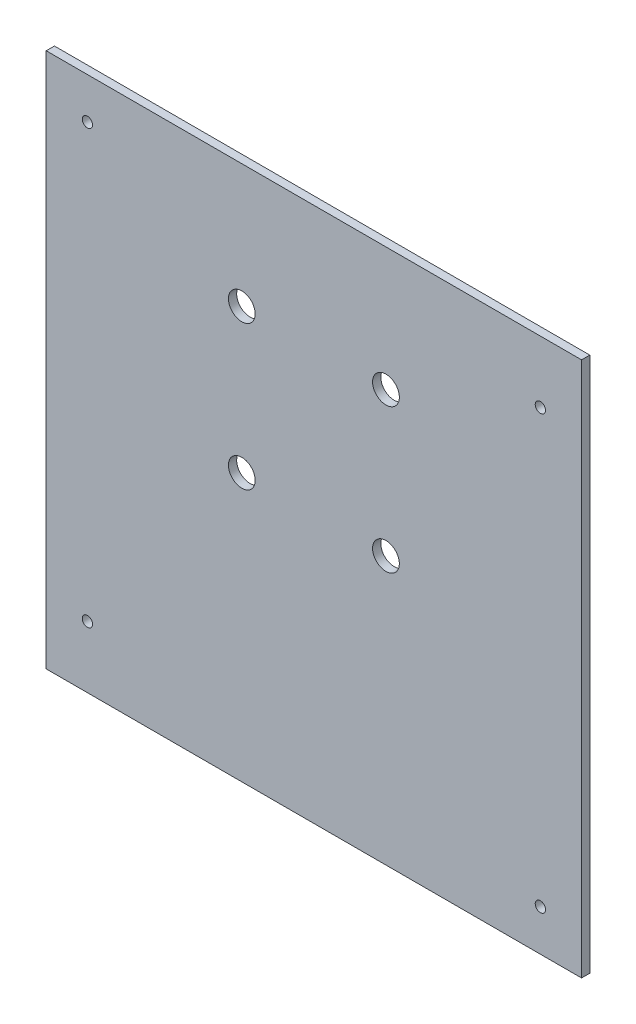
ISO-10303-21;
HEADER;
FILE_DESCRIPTION(('STEP AP214'),'2;1');
FILE_NAME('part.step','',(''),(''),'','','');
FILE_SCHEMA(('AUTOMOTIVE_DESIGN { 1 0 10303 214 1 1 1 1 }'));
ENDSEC;
DATA;
#1=APPLICATION_CONTEXT('core data for automotive mechanical design processes');
#2=APPLICATION_PROTOCOL_DEFINITION('international standard','automotive_design',2000,#1);
#3=PRODUCT_CONTEXT('',#1,'mechanical');
#4=PRODUCT('Part','Part','',(#3));
#5=PRODUCT_RELATED_PRODUCT_CATEGORY('part','',(#4));
#6=PRODUCT_DEFINITION_FORMATION('','',#4);
#7=PRODUCT_DEFINITION_CONTEXT('part definition',#1,'design');
#8=PRODUCT_DEFINITION('design','',#6,#7);
#9=PRODUCT_DEFINITION_SHAPE('','',#8);
#10=(LENGTH_UNIT() NAMED_UNIT(*) SI_UNIT(.MILLI.,.METRE.));
#11=(NAMED_UNIT(*) PLANE_ANGLE_UNIT() SI_UNIT($,.RADIAN.));
#12=(NAMED_UNIT(*) SI_UNIT($,.STERADIAN.) SOLID_ANGLE_UNIT());
#13=UNCERTAINTY_MEASURE_WITH_UNIT(LENGTH_MEASURE(1.E-05),#10,'distance_accuracy_value','');
#14=(GEOMETRIC_REPRESENTATION_CONTEXT(3) GLOBAL_UNCERTAINTY_ASSIGNED_CONTEXT((#13)) GLOBAL_UNIT_ASSIGNED_CONTEXT((#10,
#11,#12)) REPRESENTATION_CONTEXT('',''));
#15=CARTESIAN_POINT('',(0.,0.,0.));
#16=DIRECTION('',(0.,0.,1.));
#17=DIRECTION('',(1.,0.,0.));
#18=AXIS2_PLACEMENT_3D('',#15,#16,#17);
#19=CARTESIAN_POINT('',(0.,0.,2.));
#20=DIRECTION('',(0.,0.,-1.));
#21=DIRECTION('',(-1.,0.,0.));
#22=AXIS2_PLACEMENT_3D('',#19,#20,#21);
#23=PLANE('',#22);
#24=DIRECTION('',(0.,1.,0.));
#25=VECTOR('',#24,1.);
#26=CARTESIAN_POINT('',(65.,-82.5,2.));
#27=LINE('',#26,#25);
#28=CARTESIAN_POINT('',(65.,-82.5,2.));
#29=VERTEX_POINT('',#28);
#30=CARTESIAN_POINT('',(65.,47.5,2.));
#31=VERTEX_POINT('',#30);
#32=EDGE_CURVE('E89',#29,#31,#27,.T.);
#33=ORIENTED_EDGE('',*,*,#32,.T.);
#34=DIRECTION('',(-1.,0.,0.));
#35=VECTOR('',#34,1.);
#36=CARTESIAN_POINT('',(-65.,47.5,2.));
#37=LINE('',#36,#35);
#38=CARTESIAN_POINT('',(-65.,47.5,2.));
#39=VERTEX_POINT('',#38);
#40=EDGE_CURVE('E84',#31,#39,#37,.T.);
#41=ORIENTED_EDGE('',*,*,#40,.T.);
#42=DIRECTION('',(0.,-1.,0.));
#43=VECTOR('',#42,1.);
#44=CARTESIAN_POINT('',(-65.,-82.5,2.));
#45=LINE('',#44,#43);
#46=CARTESIAN_POINT('',(-65.,-82.5,2.));
#47=VERTEX_POINT('',#46);
#48=EDGE_CURVE('E87',#39,#47,#45,.T.);
#49=ORIENTED_EDGE('',*,*,#48,.T.);
#50=DIRECTION('',(1.,0.,0.));
#51=VECTOR('',#50,1.);
#52=CARTESIAN_POINT('',(-65.,-82.5,2.));
#53=LINE('',#52,#51);
#54=EDGE_CURVE('E54',#47,#29,#53,.T.);
#55=ORIENTED_EDGE('',*,*,#54,.T.);
#56=EDGE_LOOP('',(#33,#41,#49,#55));
#57=FACE_BOUND('',#56,.T.);
#58=CARTESIAN_POINT('',(-55.,37.5,2.));
#59=DIRECTION('',(0.,0.,1.));
#60=DIRECTION('',(1.,0.,0.));
#61=AXIS2_PLACEMENT_3D('',#58,#59,#60);
#62=CIRCLE('',#61,1.25);
#63=CARTESIAN_POINT('',(-53.75,37.5,2.));
#64=VERTEX_POINT('',#63);
#65=EDGE_CURVE('E104',#64,#64,#62,.T.);
#66=ORIENTED_EDGE('',*,*,#65,.F.);
#67=EDGE_LOOP('',(#66));
#68=FACE_BOUND('',#67,.T.);
#69=CARTESIAN_POINT('',(55.,32.5,2.));
#70=DIRECTION('',(0.,0.,1.));
#71=DIRECTION('',(1.,0.,0.));
#72=AXIS2_PLACEMENT_3D('',#69,#70,#71);
#73=CIRCLE('',#72,1.25);
#74=CARTESIAN_POINT('',(56.25,32.5,2.));
#75=VERTEX_POINT('',#74);
#76=EDGE_CURVE('E119',#75,#75,#73,.T.);
#77=ORIENTED_EDGE('',*,*,#76,.F.);
#78=EDGE_LOOP('',(#77));
#79=FACE_BOUND('',#78,.T.);
#80=CARTESIAN_POINT('',(55.,-72.5,2.));
#81=DIRECTION('',(0.,0.,1.));
#82=DIRECTION('',(1.,0.,0.));
#83=AXIS2_PLACEMENT_3D('',#80,#81,#82);
#84=CIRCLE('',#83,1.25);
#85=CARTESIAN_POINT('',(56.25,-72.5,2.));
#86=VERTEX_POINT('',#85);
#87=EDGE_CURVE('E125',#86,#86,#84,.T.);
#88=ORIENTED_EDGE('',*,*,#87,.F.);
#89=EDGE_LOOP('',(#88));
#90=FACE_BOUND('',#89,.T.);
#91=CARTESIAN_POINT('',(-55.,-67.5,2.));
#92=DIRECTION('',(0.,0.,1.));
#93=DIRECTION('',(1.,0.,0.));
#94=AXIS2_PLACEMENT_3D('',#91,#92,#93);
#95=CIRCLE('',#94,1.25);
#96=CARTESIAN_POINT('',(-53.75,-67.5,2.));
#97=VERTEX_POINT('',#96);
#98=EDGE_CURVE('E131',#97,#97,#95,.T.);
#99=ORIENTED_EDGE('',*,*,#98,.F.);
#100=EDGE_LOOP('',(#99));
#101=FACE_BOUND('',#100,.T.);
#102=CARTESIAN_POINT('',(-17.5,17.5,2.));
#103=DIRECTION('',(0.,0.,1.));
#104=DIRECTION('',(1.,0.,0.));
#105=AXIS2_PLACEMENT_3D('',#102,#103,#104);
#106=CIRCLE('',#105,3.25);
#107=CARTESIAN_POINT('',(-14.25,17.5,2.));
#108=VERTEX_POINT('',#107);
#109=EDGE_CURVE('E137',#108,#108,#106,.T.);
#110=ORIENTED_EDGE('',*,*,#109,.F.);
#111=EDGE_LOOP('',(#110));
#112=FACE_BOUND('',#111,.T.);
#113=CARTESIAN_POINT('',(17.5,17.5,2.));
#114=DIRECTION('',(0.,0.,1.));
#115=DIRECTION('',(1.,0.,0.));
#116=AXIS2_PLACEMENT_3D('',#113,#114,#115);
#117=CIRCLE('',#116,3.25);
#118=CARTESIAN_POINT('',(20.75,17.5,2.));
#119=VERTEX_POINT('',#118);
#120=EDGE_CURVE('E143',#119,#119,#117,.T.);
#121=ORIENTED_EDGE('',*,*,#120,.F.);
#122=EDGE_LOOP('',(#121));
#123=FACE_BOUND('',#122,.T.);
#124=CARTESIAN_POINT('',(-17.5,-17.5,2.));
#125=DIRECTION('',(0.,0.,1.));
#126=DIRECTION('',(1.,0.,0.));
#127=AXIS2_PLACEMENT_3D('',#124,#125,#126);
#128=CIRCLE('',#127,3.25);
#129=CARTESIAN_POINT('',(-14.25,-17.5,2.));
#130=VERTEX_POINT('',#129);
#131=EDGE_CURVE('E149',#130,#130,#128,.T.);
#132=ORIENTED_EDGE('',*,*,#131,.F.);
#133=EDGE_LOOP('',(#132));
#134=FACE_BOUND('',#133,.T.);
#135=CARTESIAN_POINT('',(17.5,-17.5,2.));
#136=DIRECTION('',(0.,0.,1.));
#137=DIRECTION('',(1.,0.,0.));
#138=AXIS2_PLACEMENT_3D('',#135,#136,#137);
#139=CIRCLE('',#138,3.25);
#140=CARTESIAN_POINT('',(20.75,-17.5,2.));
#141=VERTEX_POINT('',#140);
#142=EDGE_CURVE('E155',#141,#141,#139,.T.);
#143=ORIENTED_EDGE('',*,*,#142,.F.);
#144=EDGE_LOOP('',(#143));
#145=FACE_BOUND('',#144,.T.);
#146=ADVANCED_FACE('F37',(#57,#68,#79,#90,#101,#112,#123,#134,#145),#23,.F.);
#147=CARTESIAN_POINT('',(0.,0.,0.));
#148=DIRECTION('',(0.,0.,-1.));
#149=DIRECTION('',(-1.,0.,0.));
#150=AXIS2_PLACEMENT_3D('',#147,#148,#149);
#151=PLANE('',#150);
#152=CARTESIAN_POINT('',(-17.5,-17.5,0.));
#153=DIRECTION('',(0.,0.,1.));
#154=DIRECTION('',(1.,0.,0.));
#155=AXIS2_PLACEMENT_3D('',#152,#153,#154);
#156=CIRCLE('',#155,3.25);
#157=CARTESIAN_POINT('',(-14.25,-17.5,0.));
#158=VERTEX_POINT('',#157);
#159=EDGE_CURVE('E152',#158,#158,#156,.T.);
#160=ORIENTED_EDGE('',*,*,#159,.T.);
#161=EDGE_LOOP('',(#160));
#162=FACE_BOUND('',#161,.T.);
#163=CARTESIAN_POINT('',(-17.5,17.5,0.));
#164=DIRECTION('',(0.,0.,1.));
#165=DIRECTION('',(1.,0.,0.));
#166=AXIS2_PLACEMENT_3D('',#163,#164,#165);
#167=CIRCLE('',#166,3.25);
#168=CARTESIAN_POINT('',(-14.25,17.5,0.));
#169=VERTEX_POINT('',#168);
#170=EDGE_CURVE('E140',#169,#169,#167,.T.);
#171=ORIENTED_EDGE('',*,*,#170,.T.);
#172=EDGE_LOOP('',(#171));
#173=FACE_BOUND('',#172,.T.);
#174=CARTESIAN_POINT('',(55.,-72.5,0.));
#175=DIRECTION('',(0.,0.,1.));
#176=DIRECTION('',(1.,0.,0.));
#177=AXIS2_PLACEMENT_3D('',#174,#175,#176);
#178=CIRCLE('',#177,1.25);
#179=CARTESIAN_POINT('',(56.25,-72.5,0.));
#180=VERTEX_POINT('',#179);
#181=EDGE_CURVE('E128',#180,#180,#178,.T.);
#182=ORIENTED_EDGE('',*,*,#181,.T.);
#183=EDGE_LOOP('',(#182));
#184=FACE_BOUND('',#183,.T.);
#185=CARTESIAN_POINT('',(-55.,37.5,0.));
#186=DIRECTION('',(0.,0.,1.));
#187=DIRECTION('',(1.,0.,0.));
#188=AXIS2_PLACEMENT_3D('',#185,#186,#187);
#189=CIRCLE('',#188,1.25);
#190=CARTESIAN_POINT('',(-53.75,37.5,0.));
#191=VERTEX_POINT('',#190);
#192=EDGE_CURVE('E116',#191,#191,#189,.T.);
#193=ORIENTED_EDGE('',*,*,#192,.T.);
#194=EDGE_LOOP('',(#193));
#195=FACE_BOUND('',#194,.T.);
#196=DIRECTION('',(0.,1.,0.));
#197=VECTOR('',#196,1.);
#198=CARTESIAN_POINT('',(65.,-82.5,0.));
#199=LINE('',#198,#197);
#200=CARTESIAN_POINT('',(65.,-82.5,0.));
#201=VERTEX_POINT('',#200);
#202=CARTESIAN_POINT('',(65.,47.5,0.));
#203=VERTEX_POINT('',#202);
#204=EDGE_CURVE('E101',#201,#203,#199,.T.);
#205=ORIENTED_EDGE('',*,*,#204,.F.);
#206=DIRECTION('',(1.,0.,0.));
#207=VECTOR('',#206,1.);
#208=CARTESIAN_POINT('',(-65.,-82.5,0.));
#209=LINE('',#208,#207);
#210=CARTESIAN_POINT('',(-65.,-82.5,0.));
#211=VERTEX_POINT('',#210);
#212=EDGE_CURVE('E77',#211,#201,#209,.T.);
#213=ORIENTED_EDGE('',*,*,#212,.F.);
#214=DIRECTION('',(0.,-1.,0.));
#215=VECTOR('',#214,1.);
#216=CARTESIAN_POINT('',(-65.,-82.5,0.));
#217=LINE('',#216,#215);
#218=CARTESIAN_POINT('',(-65.,47.5,0.));
#219=VERTEX_POINT('',#218);
#220=EDGE_CURVE('E71',#219,#211,#217,.T.);
#221=ORIENTED_EDGE('',*,*,#220,.F.);
#222=DIRECTION('',(-1.,0.,0.));
#223=VECTOR('',#222,1.);
#224=CARTESIAN_POINT('',(-65.,47.5,0.));
#225=LINE('',#224,#223);
#226=EDGE_CURVE('E93',#203,#219,#225,.T.);
#227=ORIENTED_EDGE('',*,*,#226,.F.);
#228=EDGE_LOOP('',(#205,#213,#221,#227));
#229=FACE_BOUND('',#228,.T.);
#230=CARTESIAN_POINT('',(55.,32.5,0.));
#231=DIRECTION('',(0.,0.,1.));
#232=DIRECTION('',(1.,0.,0.));
#233=AXIS2_PLACEMENT_3D('',#230,#231,#232);
#234=CIRCLE('',#233,1.25);
#235=CARTESIAN_POINT('',(56.25,32.5,0.));
#236=VERTEX_POINT('',#235);
#237=EDGE_CURVE('E122',#236,#236,#234,.T.);
#238=ORIENTED_EDGE('',*,*,#237,.T.);
#239=EDGE_LOOP('',(#238));
#240=FACE_BOUND('',#239,.T.);
#241=CARTESIAN_POINT('',(-55.,-67.5,0.));
#242=DIRECTION('',(0.,0.,1.));
#243=DIRECTION('',(1.,0.,0.));
#244=AXIS2_PLACEMENT_3D('',#241,#242,#243);
#245=CIRCLE('',#244,1.25);
#246=CARTESIAN_POINT('',(-53.75,-67.5,0.));
#247=VERTEX_POINT('',#246);
#248=EDGE_CURVE('E134',#247,#247,#245,.T.);
#249=ORIENTED_EDGE('',*,*,#248,.T.);
#250=EDGE_LOOP('',(#249));
#251=FACE_BOUND('',#250,.T.);
#252=CARTESIAN_POINT('',(17.5,17.5,0.));
#253=DIRECTION('',(0.,0.,1.));
#254=DIRECTION('',(1.,0.,0.));
#255=AXIS2_PLACEMENT_3D('',#252,#253,#254);
#256=CIRCLE('',#255,3.25);
#257=CARTESIAN_POINT('',(20.75,17.5,0.));
#258=VERTEX_POINT('',#257);
#259=EDGE_CURVE('E146',#258,#258,#256,.T.);
#260=ORIENTED_EDGE('',*,*,#259,.T.);
#261=EDGE_LOOP('',(#260));
#262=FACE_BOUND('',#261,.T.);
#263=CARTESIAN_POINT('',(17.5,-17.5,0.));
#264=DIRECTION('',(0.,0.,1.));
#265=DIRECTION('',(1.,0.,0.));
#266=AXIS2_PLACEMENT_3D('',#263,#264,#265);
#267=CIRCLE('',#266,3.25);
#268=CARTESIAN_POINT('',(20.75,-17.5,0.));
#269=VERTEX_POINT('',#268);
#270=EDGE_CURVE('E158',#269,#269,#267,.T.);
#271=ORIENTED_EDGE('',*,*,#270,.T.);
#272=EDGE_LOOP('',(#271));
#273=FACE_BOUND('',#272,.T.);
#274=ADVANCED_FACE('F112',(#162,#173,#184,#195,#229,#240,#251,#262,#273),#151,.T.);
#275=CARTESIAN_POINT('',(65.,-82.5,2.));
#276=DIRECTION('',(-1.,0.,0.));
#277=DIRECTION('',(0.,0.,1.));
#278=AXIS2_PLACEMENT_3D('',#275,#276,#277);
#279=PLANE('',#278);
#280=ORIENTED_EDGE('',*,*,#204,.T.);
#281=DIRECTION('',(0.,0.,-1.));
#282=VECTOR('',#281,1.);
#283=CARTESIAN_POINT('',(65.,47.5,2.));
#284=LINE('',#283,#282);
#285=EDGE_CURVE('E11',#31,#203,#284,.T.);
#286=ORIENTED_EDGE('',*,*,#285,.F.);
#287=ORIENTED_EDGE('',*,*,#32,.F.);
#288=DIRECTION('',(0.,0.,-1.));
#289=VECTOR('',#288,1.);
#290=CARTESIAN_POINT('',(65.,-82.5,2.));
#291=LINE('',#290,#289);
#292=EDGE_CURVE('E97',#29,#201,#291,.T.);
#293=ORIENTED_EDGE('',*,*,#292,.T.);
#294=EDGE_LOOP('',(#280,#286,#287,#293));
#295=FACE_BOUND('',#294,.T.);
#296=ADVANCED_FACE('F39',(#295),#279,.F.);
#297=CARTESIAN_POINT('',(-65.,47.5,2.));
#298=DIRECTION('',(0.,-1.,0.));
#299=DIRECTION('',(0.,0.,-1.));
#300=AXIS2_PLACEMENT_3D('',#297,#298,#299);
#301=PLANE('',#300);
#302=ORIENTED_EDGE('',*,*,#226,.T.);
#303=DIRECTION('',(0.,0.,-1.));
#304=VECTOR('',#303,1.);
#305=CARTESIAN_POINT('',(-65.,47.5,2.));
#306=LINE('',#305,#304);
#307=EDGE_CURVE('E46',#39,#219,#306,.T.);
#308=ORIENTED_EDGE('',*,*,#307,.F.);
#309=ORIENTED_EDGE('',*,*,#40,.F.);
#310=ORIENTED_EDGE('',*,*,#285,.T.);
#311=EDGE_LOOP('',(#302,#308,#309,#310));
#312=FACE_BOUND('',#311,.T.);
#313=ADVANCED_FACE('F92',(#312),#301,.F.);
#314=CARTESIAN_POINT('',(-65.,-82.5,2.));
#315=DIRECTION('',(1.,0.,0.));
#316=DIRECTION('',(0.,0.,-1.));
#317=AXIS2_PLACEMENT_3D('',#314,#315,#316);
#318=PLANE('',#317);
#319=ORIENTED_EDGE('',*,*,#220,.T.);
#320=DIRECTION('',(0.,0.,-1.));
#321=VECTOR('',#320,1.);
#322=CARTESIAN_POINT('',(-65.,-82.5,2.));
#323=LINE('',#322,#321);
#324=EDGE_CURVE('E94',#47,#211,#323,.T.);
#325=ORIENTED_EDGE('',*,*,#324,.F.);
#326=ORIENTED_EDGE('',*,*,#48,.F.);
#327=ORIENTED_EDGE('',*,*,#307,.T.);
#328=EDGE_LOOP('',(#319,#325,#326,#327));
#329=FACE_BOUND('',#328,.T.);
#330=ADVANCED_FACE('F95',(#329),#318,.F.);
#331=CARTESIAN_POINT('',(-65.,-82.5,2.));
#332=DIRECTION('',(0.,1.,0.));
#333=DIRECTION('',(0.,0.,1.));
#334=AXIS2_PLACEMENT_3D('',#331,#332,#333);
#335=PLANE('',#334);
#336=ORIENTED_EDGE('',*,*,#212,.T.);
#337=ORIENTED_EDGE('',*,*,#292,.F.);
#338=ORIENTED_EDGE('',*,*,#54,.F.);
#339=ORIENTED_EDGE('',*,*,#324,.T.);
#340=EDGE_LOOP('',(#336,#337,#338,#339));
#341=FACE_BOUND('',#340,.T.);
#342=ADVANCED_FACE('F109',(#341),#335,.F.);
#343=CARTESIAN_POINT('',(-55.,37.5,2.));
#344=DIRECTION('',(0.,0.,-1.));
#345=DIRECTION('',(-1.,0.,0.));
#346=AXIS2_PLACEMENT_3D('',#343,#344,#345);
#347=CYLINDRICAL_SURFACE('',#346,1.25);
#348=ORIENTED_EDGE('',*,*,#65,.T.);
#349=EDGE_LOOP('',(#348));
#350=FACE_BOUND('',#349,.T.);
#351=ORIENTED_EDGE('',*,*,#192,.F.);
#352=EDGE_LOOP('',(#351));
#353=FACE_BOUND('',#352,.T.);
#354=ADVANCED_FACE('F175',(#350,#353),#347,.F.);
#355=CARTESIAN_POINT('',(55.,32.5,2.));
#356=DIRECTION('',(0.,0.,-1.));
#357=DIRECTION('',(-1.,0.,0.));
#358=AXIS2_PLACEMENT_3D('',#355,#356,#357);
#359=CYLINDRICAL_SURFACE('',#358,1.25);
#360=ORIENTED_EDGE('',*,*,#76,.T.);
#361=EDGE_LOOP('',(#360));
#362=FACE_BOUND('',#361,.T.);
#363=ORIENTED_EDGE('',*,*,#237,.F.);
#364=EDGE_LOOP('',(#363));
#365=FACE_BOUND('',#364,.T.);
#366=ADVANCED_FACE('F221',(#362,#365),#359,.F.);
#367=CARTESIAN_POINT('',(55.,-72.5,2.));
#368=DIRECTION('',(0.,0.,-1.));
#369=DIRECTION('',(-1.,0.,0.));
#370=AXIS2_PLACEMENT_3D('',#367,#368,#369);
#371=CYLINDRICAL_SURFACE('',#370,1.25);
#372=ORIENTED_EDGE('',*,*,#87,.T.);
#373=EDGE_LOOP('',(#372));
#374=FACE_BOUND('',#373,.T.);
#375=ORIENTED_EDGE('',*,*,#181,.F.);
#376=EDGE_LOOP('',(#375));
#377=FACE_BOUND('',#376,.T.);
#378=ADVANCED_FACE('F229',(#374,#377),#371,.F.);
#379=CARTESIAN_POINT('',(-55.,-67.5,2.));
#380=DIRECTION('',(0.,0.,-1.));
#381=DIRECTION('',(-1.,0.,0.));
#382=AXIS2_PLACEMENT_3D('',#379,#380,#381);
#383=CYLINDRICAL_SURFACE('',#382,1.25);
#384=ORIENTED_EDGE('',*,*,#98,.T.);
#385=EDGE_LOOP('',(#384));
#386=FACE_BOUND('',#385,.T.);
#387=ORIENTED_EDGE('',*,*,#248,.F.);
#388=EDGE_LOOP('',(#387));
#389=FACE_BOUND('',#388,.T.);
#390=ADVANCED_FACE('F237',(#386,#389),#383,.F.);
#391=CARTESIAN_POINT('',(-17.5,17.5,2.));
#392=DIRECTION('',(0.,0.,-1.));
#393=DIRECTION('',(-1.,0.,0.));
#394=AXIS2_PLACEMENT_3D('',#391,#392,#393);
#395=CYLINDRICAL_SURFACE('',#394,3.25);
#396=ORIENTED_EDGE('',*,*,#109,.T.);
#397=EDGE_LOOP('',(#396));
#398=FACE_BOUND('',#397,.T.);
#399=ORIENTED_EDGE('',*,*,#170,.F.);
#400=EDGE_LOOP('',(#399));
#401=FACE_BOUND('',#400,.T.);
#402=ADVANCED_FACE('F246',(#398,#401),#395,.F.);
#403=CARTESIAN_POINT('',(17.5,17.5,2.));
#404=DIRECTION('',(0.,0.,-1.));
#405=DIRECTION('',(-1.,0.,0.));
#406=AXIS2_PLACEMENT_3D('',#403,#404,#405);
#407=CYLINDRICAL_SURFACE('',#406,3.25);
#408=ORIENTED_EDGE('',*,*,#120,.T.);
#409=EDGE_LOOP('',(#408));
#410=FACE_BOUND('',#409,.T.);
#411=ORIENTED_EDGE('',*,*,#259,.F.);
#412=EDGE_LOOP('',(#411));
#413=FACE_BOUND('',#412,.T.);
#414=ADVANCED_FACE('F255',(#410,#413),#407,.F.);
#415=CARTESIAN_POINT('',(-17.5,-17.5,2.));
#416=DIRECTION('',(0.,0.,-1.));
#417=DIRECTION('',(-1.,0.,0.));
#418=AXIS2_PLACEMENT_3D('',#415,#416,#417);
#419=CYLINDRICAL_SURFACE('',#418,3.25);
#420=ORIENTED_EDGE('',*,*,#131,.T.);
#421=EDGE_LOOP('',(#420));
#422=FACE_BOUND('',#421,.T.);
#423=ORIENTED_EDGE('',*,*,#159,.F.);
#424=EDGE_LOOP('',(#423));
#425=FACE_BOUND('',#424,.T.);
#426=ADVANCED_FACE('F264',(#422,#425),#419,.F.);
#427=CARTESIAN_POINT('',(17.5,-17.5,2.));
#428=DIRECTION('',(0.,0.,-1.));
#429=DIRECTION('',(-1.,0.,0.));
#430=AXIS2_PLACEMENT_3D('',#427,#428,#429);
#431=CYLINDRICAL_SURFACE('',#430,3.25);
#432=ORIENTED_EDGE('',*,*,#142,.T.);
#433=EDGE_LOOP('',(#432));
#434=FACE_BOUND('',#433,.T.);
#435=ORIENTED_EDGE('',*,*,#270,.F.);
#436=EDGE_LOOP('',(#435));
#437=FACE_BOUND('',#436,.T.);
#438=ADVANCED_FACE('F164',(#434,#437),#431,.F.);
#439=CLOSED_SHELL('',(#146,#274,#296,#313,#330,#342,#354,#366,#378,#390,#402,#414,#426,#438));
#440=MANIFOLD_SOLID_BREP('B2',#439);
#441=ADVANCED_BREP_SHAPE_REPRESENTATION('',(#18,#440),#14);
#442=SHAPE_DEFINITION_REPRESENTATION(#9,#441);
ENDSEC;
END-ISO-10303-21;
